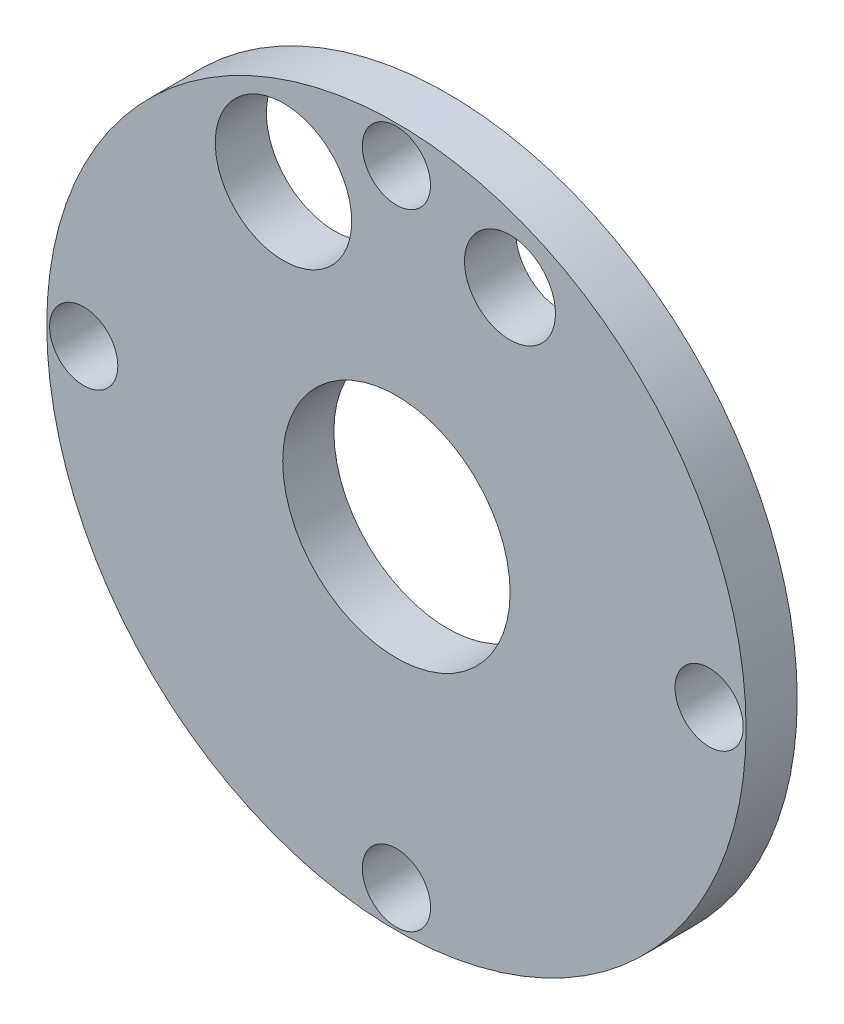
ISO-10303-21;
HEADER;
FILE_DESCRIPTION(('STEP AP214'),'2;1');
FILE_NAME('part.step','',(''),(''),'','','');
FILE_SCHEMA(('AUTOMOTIVE_DESIGN { 1 0 10303 214 1 1 1 1 }'));
ENDSEC;
DATA;
#1=APPLICATION_CONTEXT('core data for automotive mechanical design processes');
#2=APPLICATION_PROTOCOL_DEFINITION('international standard','automotive_design',2000,#1);
#3=PRODUCT_CONTEXT('',#1,'mechanical');
#4=PRODUCT('Part','Part','',(#3));
#5=PRODUCT_RELATED_PRODUCT_CATEGORY('part','',(#4));
#6=PRODUCT_DEFINITION_FORMATION('','',#4);
#7=PRODUCT_DEFINITION_CONTEXT('part definition',#1,'design');
#8=PRODUCT_DEFINITION('design','',#6,#7);
#9=PRODUCT_DEFINITION_SHAPE('','',#8);
#10=(LENGTH_UNIT() NAMED_UNIT(*) SI_UNIT(.MILLI.,.METRE.));
#11=(NAMED_UNIT(*) PLANE_ANGLE_UNIT() SI_UNIT($,.RADIAN.));
#12=(NAMED_UNIT(*) SI_UNIT($,.STERADIAN.) SOLID_ANGLE_UNIT());
#13=UNCERTAINTY_MEASURE_WITH_UNIT(LENGTH_MEASURE(1.E-05),#10,'distance_accuracy_value','');
#14=(GEOMETRIC_REPRESENTATION_CONTEXT(3) GLOBAL_UNCERTAINTY_ASSIGNED_CONTEXT((#13)) GLOBAL_UNIT_ASSIGNED_CONTEXT((#10,
#11,#12)) REPRESENTATION_CONTEXT('',''));
#15=CARTESIAN_POINT('',(0.,0.,0.));
#16=DIRECTION('',(0.,0.,1.));
#17=DIRECTION('',(1.,0.,0.));
#18=AXIS2_PLACEMENT_3D('',#15,#16,#17);
#19=CARTESIAN_POINT('',(0.,0.,68.5));
#20=DIRECTION('',(0.,0.,-1.));
#21=DIRECTION('',(-1.,0.,0.));
#22=AXIS2_PLACEMENT_3D('',#19,#20,#21);
#23=CYLINDRICAL_SURFACE('',#22,30.75);
#24=CARTESIAN_POINT('',(0.,0.,68.5));
#25=DIRECTION('',(0.,0.,1.));
#26=DIRECTION('',(1.,0.,0.));
#27=AXIS2_PLACEMENT_3D('',#24,#25,#26);
#28=CIRCLE('',#27,30.75);
#29=CARTESIAN_POINT('',(30.75,0.,68.5));
#30=VERTEX_POINT('',#29);
#31=EDGE_CURVE('E10',#30,#30,#28,.T.);
#32=ORIENTED_EDGE('',*,*,#31,.F.);
#33=EDGE_LOOP('',(#32));
#34=FACE_BOUND('',#33,.T.);
#35=CARTESIAN_POINT('',(0.,0.,64.));
#36=DIRECTION('',(0.,0.,1.));
#37=DIRECTION('',(1.,0.,0.));
#38=AXIS2_PLACEMENT_3D('',#35,#36,#37);
#39=CIRCLE('',#38,30.75);
#40=CARTESIAN_POINT('',(30.75,0.,64.));
#41=VERTEX_POINT('',#40);
#42=EDGE_CURVE('E40',#41,#41,#39,.T.);
#43=ORIENTED_EDGE('',*,*,#42,.T.);
#44=EDGE_LOOP('',(#43));
#45=FACE_BOUND('',#44,.T.);
#46=ADVANCED_FACE('F33',(#34,#45),#23,.T.);
#47=CARTESIAN_POINT('',(9.98690326969372,23.2244207572088,62.5));
#48=DIRECTION('',(0.,0.,1.));
#49=DIRECTION('',(1.,0.,0.));
#50=AXIS2_PLACEMENT_3D('',#47,#48,#49);
#51=CYLINDRICAL_SURFACE('',#50,4.);
#52=CARTESIAN_POINT('',(9.98690326969372,23.2244207572088,68.5));
#53=DIRECTION('',(0.,0.,1.));
#54=DIRECTION('',(1.,0.,0.));
#55=AXIS2_PLACEMENT_3D('',#52,#53,#54);
#56=CIRCLE('',#55,4.);
#57=CARTESIAN_POINT('',(13.9869032696937,23.2244207572088,68.5));
#58=VERTEX_POINT('',#57);
#59=EDGE_CURVE('E48',#58,#58,#56,.T.);
#60=ORIENTED_EDGE('',*,*,#59,.T.);
#61=EDGE_LOOP('',(#60));
#62=FACE_BOUND('',#61,.T.);
#63=CARTESIAN_POINT('',(9.98690326969372,23.2244207572088,64.));
#64=DIRECTION('',(0.,0.,1.));
#65=DIRECTION('',(1.,0.,0.));
#66=AXIS2_PLACEMENT_3D('',#63,#64,#65);
#67=CIRCLE('',#66,4.);
#68=CARTESIAN_POINT('',(13.9869032696937,23.2244207572088,64.));
#69=VERTEX_POINT('',#68);
#70=EDGE_CURVE('E45',#69,#69,#67,.T.);
#71=ORIENTED_EDGE('',*,*,#70,.F.);
#72=EDGE_LOOP('',(#71));
#73=FACE_BOUND('',#72,.T.);
#74=ADVANCED_FACE('F108',(#62,#73),#51,.F.);
#75=CARTESIAN_POINT('',(-9.93152915090631,21.2982329953613,58.5));
#76=DIRECTION('',(0.,0.,1.));
#77=DIRECTION('',(1.,0.,0.));
#78=AXIS2_PLACEMENT_3D('',#75,#76,#77);
#79=CYLINDRICAL_SURFACE('',#78,6.00000000000002);
#80=CARTESIAN_POINT('',(-9.93152915090631,21.2982329953613,68.5));
#81=DIRECTION('',(0.,0.,1.));
#82=DIRECTION('',(1.,0.,0.));
#83=AXIS2_PLACEMENT_3D('',#80,#81,#82);
#84=CIRCLE('',#83,6.00000000000002);
#85=CARTESIAN_POINT('',(-3.93152915090629,21.2982329953613,68.5));
#86=VERTEX_POINT('',#85);
#87=EDGE_CURVE('E54',#86,#86,#84,.T.);
#88=ORIENTED_EDGE('',*,*,#87,.T.);
#89=EDGE_LOOP('',(#88));
#90=FACE_BOUND('',#89,.T.);
#91=CARTESIAN_POINT('',(-9.93152915090631,21.2982329953613,64.));
#92=DIRECTION('',(0.,0.,1.));
#93=DIRECTION('',(1.,0.,0.));
#94=AXIS2_PLACEMENT_3D('',#91,#92,#93);
#95=CIRCLE('',#94,6.00000000000002);
#96=CARTESIAN_POINT('',(-3.93152915090629,21.2982329953613,64.));
#97=VERTEX_POINT('',#96);
#98=EDGE_CURVE('E52',#97,#97,#95,.T.);
#99=ORIENTED_EDGE('',*,*,#98,.F.);
#100=EDGE_LOOP('',(#99));
#101=FACE_BOUND('',#100,.T.);
#102=ADVANCED_FACE('F113',(#90,#101),#79,.F.);
#103=CARTESIAN_POINT('',(0.,0.,68.5));
#104=DIRECTION('',(0.,0.,1.));
#105=DIRECTION('',(1.,0.,0.));
#106=AXIS2_PLACEMENT_3D('',#103,#104,#105);
#107=PLANE('',#106);
#108=CARTESIAN_POINT('',(0.,0.,68.5));
#109=DIRECTION('',(0.,0.,1.));
#110=DIRECTION('',(1.,0.,0.));
#111=AXIS2_PLACEMENT_3D('',#108,#109,#110);
#112=CIRCLE('',#111,10.);
#113=CARTESIAN_POINT('',(10.,0.,68.5));
#114=VERTEX_POINT('',#113);
#115=EDGE_CURVE('E62',#114,#114,#112,.T.);
#116=ORIENTED_EDGE('',*,*,#115,.F.);
#117=EDGE_LOOP('',(#116));
#118=FACE_BOUND('',#117,.T.);
#119=ORIENTED_EDGE('',*,*,#87,.F.);
#120=EDGE_LOOP('',(#119));
#121=FACE_BOUND('',#120,.T.);
#122=ORIENTED_EDGE('',*,*,#59,.F.);
#123=EDGE_LOOP('',(#122));
#124=FACE_BOUND('',#123,.T.);
#125=CARTESIAN_POINT('',(27.5,0.,68.5));
#126=DIRECTION('',(0.,0.,1.));
#127=DIRECTION('',(1.,0.,0.));
#128=AXIS2_PLACEMENT_3D('',#125,#126,#127);
#129=CIRCLE('',#128,3.);
#130=CARTESIAN_POINT('',(30.5,0.,68.5));
#131=VERTEX_POINT('',#130);
#132=EDGE_CURVE('E69',#131,#131,#129,.T.);
#133=ORIENTED_EDGE('',*,*,#132,.F.);
#134=EDGE_LOOP('',(#133));
#135=FACE_BOUND('',#134,.T.);
#136=CARTESIAN_POINT('',(0.,27.5,68.5));
#137=DIRECTION('',(0.,0.,1.));
#138=DIRECTION('',(1.,0.,0.));
#139=AXIS2_PLACEMENT_3D('',#136,#137,#138);
#140=CIRCLE('',#139,3.);
#141=CARTESIAN_POINT('',(3.,27.5,68.5));
#142=VERTEX_POINT('',#141);
#143=EDGE_CURVE('E66',#142,#142,#140,.T.);
#144=ORIENTED_EDGE('',*,*,#143,.F.);
#145=EDGE_LOOP('',(#144));
#146=FACE_BOUND('',#145,.T.);
#147=CARTESIAN_POINT('',(-27.5,0.,68.5));
#148=DIRECTION('',(0.,0.,1.));
#149=DIRECTION('',(1.,0.,0.));
#150=AXIS2_PLACEMENT_3D('',#147,#148,#149);
#151=CIRCLE('',#150,3.);
#152=CARTESIAN_POINT('',(-24.5,0.,68.5));
#153=VERTEX_POINT('',#152);
#154=EDGE_CURVE('E75',#153,#153,#151,.T.);
#155=ORIENTED_EDGE('',*,*,#154,.F.);
#156=EDGE_LOOP('',(#155));
#157=FACE_BOUND('',#156,.T.);
#158=CARTESIAN_POINT('',(0.,-27.5,68.5));
#159=DIRECTION('',(0.,0.,1.));
#160=DIRECTION('',(1.,0.,0.));
#161=AXIS2_PLACEMENT_3D('',#158,#159,#160);
#162=CIRCLE('',#161,3.);
#163=CARTESIAN_POINT('',(3.,-27.5,68.5));
#164=VERTEX_POINT('',#163);
#165=EDGE_CURVE('E72',#164,#164,#162,.T.);
#166=ORIENTED_EDGE('',*,*,#165,.F.);
#167=EDGE_LOOP('',(#166));
#168=FACE_BOUND('',#167,.T.);
#169=ORIENTED_EDGE('',*,*,#31,.T.);
#170=EDGE_LOOP('',(#169));
#171=FACE_BOUND('',#170,.T.);
#172=ADVANCED_FACE('F119',(#118,#121,#124,#135,#146,#157,#168,#171),#107,.T.);
#173=CARTESIAN_POINT('',(0.,0.,58.5));
#174=DIRECTION('',(0.,0.,1.));
#175=DIRECTION('',(1.,0.,0.));
#176=AXIS2_PLACEMENT_3D('',#173,#174,#175);
#177=CYLINDRICAL_SURFACE('',#176,10.);
#178=ORIENTED_EDGE('',*,*,#115,.T.);
#179=EDGE_LOOP('',(#178));
#180=FACE_BOUND('',#179,.T.);
#181=CARTESIAN_POINT('',(0.,0.,64.));
#182=DIRECTION('',(0.,0.,1.));
#183=DIRECTION('',(1.,0.,0.));
#184=AXIS2_PLACEMENT_3D('',#181,#182,#183);
#185=CIRCLE('',#184,10.);
#186=CARTESIAN_POINT('',(10.,0.,64.));
#187=VERTEX_POINT('',#186);
#188=EDGE_CURVE('E36',#187,#187,#185,.T.);
#189=ORIENTED_EDGE('',*,*,#188,.F.);
#190=EDGE_LOOP('',(#189));
#191=FACE_BOUND('',#190,.T.);
#192=ADVANCED_FACE('F97',(#180,#191),#177,.F.);
#193=CARTESIAN_POINT('',(0.,0.,64.));
#194=DIRECTION('',(0.,0.,1.));
#195=DIRECTION('',(1.,0.,0.));
#196=AXIS2_PLACEMENT_3D('',#193,#194,#195);
#197=PLANE('',#196);
#198=ORIENTED_EDGE('',*,*,#188,.T.);
#199=EDGE_LOOP('',(#198));
#200=FACE_BOUND('',#199,.T.);
#201=ORIENTED_EDGE('',*,*,#98,.T.);
#202=EDGE_LOOP('',(#201));
#203=FACE_BOUND('',#202,.T.);
#204=ORIENTED_EDGE('',*,*,#70,.T.);
#205=EDGE_LOOP('',(#204));
#206=FACE_BOUND('',#205,.T.);
#207=CARTESIAN_POINT('',(0.,27.5,64.));
#208=DIRECTION('',(0.,0.,-1.));
#209=DIRECTION('',(-1.,0.,0.));
#210=AXIS2_PLACEMENT_3D('',#207,#208,#209);
#211=CIRCLE('',#210,3.);
#212=CARTESIAN_POINT('',(-3.,27.5,64.));
#213=VERTEX_POINT('',#212);
#214=EDGE_CURVE('E78',#213,#213,#211,.T.);
#215=ORIENTED_EDGE('',*,*,#214,.F.);
#216=EDGE_LOOP('',(#215));
#217=FACE_BOUND('',#216,.T.);
#218=CARTESIAN_POINT('',(27.5,0.,64.));
#219=DIRECTION('',(0.,0.,-1.));
#220=DIRECTION('',(-1.,0.,0.));
#221=AXIS2_PLACEMENT_3D('',#218,#219,#220);
#222=CIRCLE('',#221,3.);
#223=CARTESIAN_POINT('',(24.5,0.,64.));
#224=VERTEX_POINT('',#223);
#225=EDGE_CURVE('E85',#224,#224,#222,.T.);
#226=ORIENTED_EDGE('',*,*,#225,.F.);
#227=EDGE_LOOP('',(#226));
#228=FACE_BOUND('',#227,.T.);
#229=CARTESIAN_POINT('',(-27.5,0.,64.));
#230=DIRECTION('',(0.,0.,-1.));
#231=DIRECTION('',(-1.,0.,0.));
#232=AXIS2_PLACEMENT_3D('',#229,#230,#231);
#233=CIRCLE('',#232,3.);
#234=CARTESIAN_POINT('',(-30.5,0.,64.));
#235=VERTEX_POINT('',#234);
#236=EDGE_CURVE('E79',#235,#235,#233,.T.);
#237=ORIENTED_EDGE('',*,*,#236,.F.);
#238=EDGE_LOOP('',(#237));
#239=FACE_BOUND('',#238,.T.);
#240=CARTESIAN_POINT('',(0.,-27.5,64.));
#241=DIRECTION('',(0.,0.,-1.));
#242=DIRECTION('',(-1.,0.,0.));
#243=AXIS2_PLACEMENT_3D('',#240,#241,#242);
#244=CIRCLE('',#243,3.);
#245=CARTESIAN_POINT('',(-3.,-27.5,64.));
#246=VERTEX_POINT('',#245);
#247=EDGE_CURVE('E82',#246,#246,#244,.T.);
#248=ORIENTED_EDGE('',*,*,#247,.F.);
#249=EDGE_LOOP('',(#248));
#250=FACE_BOUND('',#249,.T.);
#251=ORIENTED_EDGE('',*,*,#42,.F.);
#252=EDGE_LOOP('',(#251));
#253=FACE_BOUND('',#252,.T.);
#254=ADVANCED_FACE('F93',(#200,#203,#206,#217,#228,#239,#250,#253),#197,.F.);
#255=CARTESIAN_POINT('',(-27.5,0.,113.));
#256=DIRECTION('',(0.,0.,-1.));
#257=DIRECTION('',(-1.,0.,0.));
#258=AXIS2_PLACEMENT_3D('',#255,#256,#257);
#259=CYLINDRICAL_SURFACE('',#258,3.);
#260=ORIENTED_EDGE('',*,*,#154,.T.);
#261=EDGE_LOOP('',(#260));
#262=FACE_BOUND('',#261,.T.);
#263=ORIENTED_EDGE('',*,*,#236,.T.);
#264=EDGE_LOOP('',(#263));
#265=FACE_BOUND('',#264,.T.);
#266=ADVANCED_FACE('F96',(#262,#265),#259,.F.);
#267=CARTESIAN_POINT('',(0.,-27.5,113.));
#268=DIRECTION('',(0.,0.,-1.));
#269=DIRECTION('',(-1.,0.,0.));
#270=AXIS2_PLACEMENT_3D('',#267,#268,#269);
#271=CYLINDRICAL_SURFACE('',#270,3.);
#272=ORIENTED_EDGE('',*,*,#165,.T.);
#273=EDGE_LOOP('',(#272));
#274=FACE_BOUND('',#273,.T.);
#275=ORIENTED_EDGE('',*,*,#247,.T.);
#276=EDGE_LOOP('',(#275));
#277=FACE_BOUND('',#276,.T.);
#278=ADVANCED_FACE('F143',(#274,#277),#271,.F.);
#279=CARTESIAN_POINT('',(27.5,0.,113.));
#280=DIRECTION('',(0.,0.,-1.));
#281=DIRECTION('',(-1.,0.,0.));
#282=AXIS2_PLACEMENT_3D('',#279,#280,#281);
#283=CYLINDRICAL_SURFACE('',#282,3.);
#284=ORIENTED_EDGE('',*,*,#132,.T.);
#285=EDGE_LOOP('',(#284));
#286=FACE_BOUND('',#285,.T.);
#287=ORIENTED_EDGE('',*,*,#225,.T.);
#288=EDGE_LOOP('',(#287));
#289=FACE_BOUND('',#288,.T.);
#290=ADVANCED_FACE('F146',(#286,#289),#283,.F.);
#291=CARTESIAN_POINT('',(0.,27.5,113.));
#292=DIRECTION('',(0.,0.,-1.));
#293=DIRECTION('',(-1.,0.,0.));
#294=AXIS2_PLACEMENT_3D('',#291,#292,#293);
#295=CYLINDRICAL_SURFACE('',#294,3.);
#296=ORIENTED_EDGE('',*,*,#143,.T.);
#297=EDGE_LOOP('',(#296));
#298=FACE_BOUND('',#297,.T.);
#299=ORIENTED_EDGE('',*,*,#214,.T.);
#300=EDGE_LOOP('',(#299));
#301=FACE_BOUND('',#300,.T.);
#302=ADVANCED_FACE('F91',(#298,#301),#295,.F.);
#303=CLOSED_SHELL('',(#46,#74,#102,#172,#192,#254,#266,#278,#290,#302));
#304=MANIFOLD_SOLID_BREP('B2',#303);
#305=ADVANCED_BREP_SHAPE_REPRESENTATION('',(#18,#304),#14);
#306=SHAPE_DEFINITION_REPRESENTATION(#9,#305);
ENDSEC;
END-ISO-10303-21;
